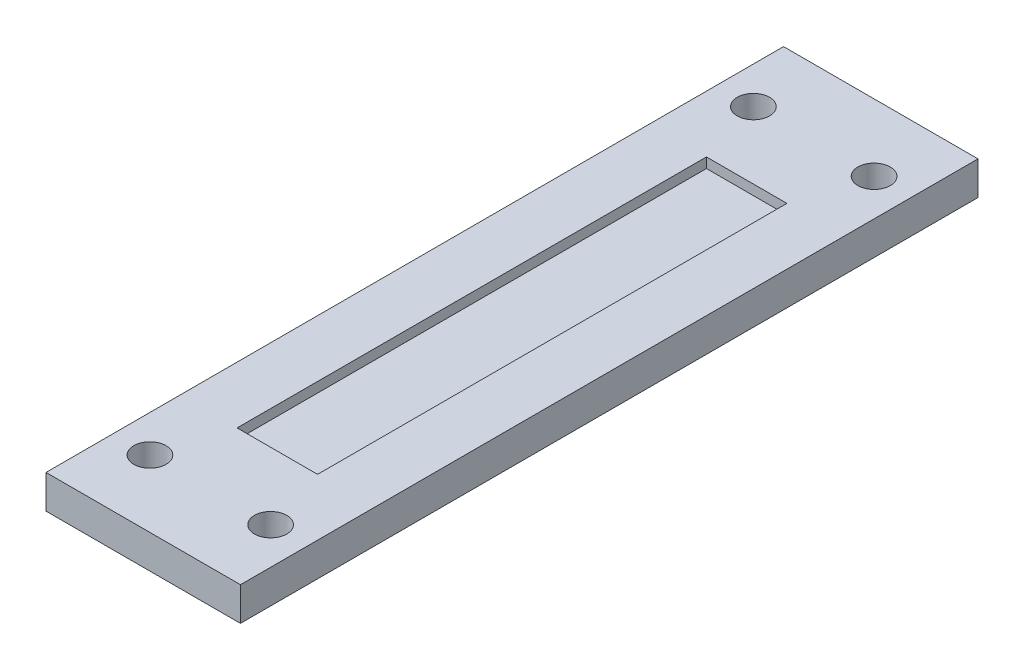
ISO-10303-21;
HEADER;
FILE_DESCRIPTION(('STEP AP214'),'2;1');
FILE_NAME('part.step','',(''),(''),'','','');
FILE_SCHEMA(('AUTOMOTIVE_DESIGN { 1 0 10303 214 1 1 1 1 }'));
ENDSEC;
DATA;
#1=APPLICATION_CONTEXT('core data for automotive mechanical design processes');
#2=APPLICATION_PROTOCOL_DEFINITION('international standard','automotive_design',2000,#1);
#3=PRODUCT_CONTEXT('',#1,'mechanical');
#4=PRODUCT('Part','Part','',(#3));
#5=PRODUCT_RELATED_PRODUCT_CATEGORY('part','',(#4));
#6=PRODUCT_DEFINITION_FORMATION('','',#4);
#7=PRODUCT_DEFINITION_CONTEXT('part definition',#1,'design');
#8=PRODUCT_DEFINITION('design','',#6,#7);
#9=PRODUCT_DEFINITION_SHAPE('','',#8);
#10=(LENGTH_UNIT() NAMED_UNIT(*) SI_UNIT(.MILLI.,.METRE.));
#11=(NAMED_UNIT(*) PLANE_ANGLE_UNIT() SI_UNIT($,.RADIAN.));
#12=(NAMED_UNIT(*) SI_UNIT($,.STERADIAN.) SOLID_ANGLE_UNIT());
#13=UNCERTAINTY_MEASURE_WITH_UNIT(LENGTH_MEASURE(1.E-05),#10,'distance_accuracy_value','');
#14=(GEOMETRIC_REPRESENTATION_CONTEXT(3) GLOBAL_UNCERTAINTY_ASSIGNED_CONTEXT((#13)) GLOBAL_UNIT_ASSIGNED_CONTEXT((#10,
#11,#12)) REPRESENTATION_CONTEXT('',''));
#15=CARTESIAN_POINT('',(0.,0.,0.));
#16=DIRECTION('',(0.,0.,1.));
#17=DIRECTION('',(1.,0.,0.));
#18=AXIS2_PLACEMENT_3D('',#15,#16,#17);
#19=CARTESIAN_POINT('',(-14.5,5.,-55.));
#20=DIRECTION('',(1.,0.,0.));
#21=DIRECTION('',(0.,0.,-1.));
#22=AXIS2_PLACEMENT_3D('',#19,#20,#21);
#23=PLANE('',#22);
#24=DIRECTION('',(0.,0.,1.));
#25=VECTOR('',#24,1.);
#26=CARTESIAN_POINT('',(-14.5,0.,-55.));
#27=LINE('',#26,#25);
#28=CARTESIAN_POINT('',(-14.5,0.,-55.));
#29=VERTEX_POINT('',#28);
#30=CARTESIAN_POINT('',(-14.5,0.,55.));
#31=VERTEX_POINT('',#30);
#32=EDGE_CURVE('E168',#29,#31,#27,.T.);
#33=ORIENTED_EDGE('',*,*,#32,.T.);
#34=DIRECTION('',(0.,-1.,0.));
#35=VECTOR('',#34,1.);
#36=CARTESIAN_POINT('',(-14.5,5.,55.));
#37=LINE('',#36,#35);
#38=CARTESIAN_POINT('',(-14.5,5.,55.));
#39=VERTEX_POINT('',#38);
#40=EDGE_CURVE('E11',#39,#31,#37,.T.);
#41=ORIENTED_EDGE('',*,*,#40,.F.);
#42=DIRECTION('',(0.,0.,1.));
#43=VECTOR('',#42,1.);
#44=CARTESIAN_POINT('',(-14.5,5.,-55.));
#45=LINE('',#44,#43);
#46=CARTESIAN_POINT('',(-14.5,5.,-55.));
#47=VERTEX_POINT('',#46);
#48=EDGE_CURVE('E171',#47,#39,#45,.T.);
#49=ORIENTED_EDGE('',*,*,#48,.F.);
#50=DIRECTION('',(0.,-1.,0.));
#51=VECTOR('',#50,1.);
#52=CARTESIAN_POINT('',(-14.5,5.,-55.));
#53=LINE('',#52,#51);
#54=EDGE_CURVE('E177',#47,#29,#53,.T.);
#55=ORIENTED_EDGE('',*,*,#54,.T.);
#56=EDGE_LOOP('',(#33,#41,#49,#55));
#57=FACE_BOUND('',#56,.T.);
#58=ADVANCED_FACE('F35',(#57),#23,.F.);
#59=CARTESIAN_POINT('',(-14.5,5.,55.));
#60=DIRECTION('',(0.,0.,-1.));
#61=DIRECTION('',(-1.,0.,0.));
#62=AXIS2_PLACEMENT_3D('',#59,#60,#61);
#63=PLANE('',#62);
#64=DIRECTION('',(1.,0.,0.));
#65=VECTOR('',#64,1.);
#66=CARTESIAN_POINT('',(-14.5,0.,55.));
#67=LINE('',#66,#65);
#68=CARTESIAN_POINT('',(14.5,0.,55.));
#69=VERTEX_POINT('',#68);
#70=EDGE_CURVE('E180',#31,#69,#67,.T.);
#71=ORIENTED_EDGE('',*,*,#70,.T.);
#72=DIRECTION('',(0.,-1.,0.));
#73=VECTOR('',#72,1.);
#74=CARTESIAN_POINT('',(14.5,5.,55.));
#75=LINE('',#74,#73);
#76=CARTESIAN_POINT('',(14.5,5.,55.));
#77=VERTEX_POINT('',#76);
#78=EDGE_CURVE('E42',#77,#69,#75,.T.);
#79=ORIENTED_EDGE('',*,*,#78,.F.);
#80=DIRECTION('',(1.,0.,0.));
#81=VECTOR('',#80,1.);
#82=CARTESIAN_POINT('',(-14.5,5.,55.));
#83=LINE('',#82,#81);
#84=EDGE_CURVE('E86',#39,#77,#83,.T.);
#85=ORIENTED_EDGE('',*,*,#84,.F.);
#86=ORIENTED_EDGE('',*,*,#40,.T.);
#87=EDGE_LOOP('',(#71,#79,#85,#86));
#88=FACE_BOUND('',#87,.T.);
#89=ADVANCED_FACE('F209',(#88),#63,.F.);
#90=CARTESIAN_POINT('',(14.5,5.,-55.));
#91=DIRECTION('',(-1.,0.,0.));
#92=DIRECTION('',(0.,0.,1.));
#93=AXIS2_PLACEMENT_3D('',#90,#91,#92);
#94=PLANE('',#93);
#95=DIRECTION('',(0.,0.,-1.));
#96=VECTOR('',#95,1.);
#97=CARTESIAN_POINT('',(14.5,0.,-55.));
#98=LINE('',#97,#96);
#99=CARTESIAN_POINT('',(14.5,0.,-55.));
#100=VERTEX_POINT('',#99);
#101=EDGE_CURVE('E182',#69,#100,#98,.T.);
#102=ORIENTED_EDGE('',*,*,#101,.T.);
#103=DIRECTION('',(0.,-1.,0.));
#104=VECTOR('',#103,1.);
#105=CARTESIAN_POINT('',(14.5,5.,-55.));
#106=LINE('',#105,#104);
#107=CARTESIAN_POINT('',(14.5,5.,-55.));
#108=VERTEX_POINT('',#107);
#109=EDGE_CURVE('E186',#108,#100,#106,.T.);
#110=ORIENTED_EDGE('',*,*,#109,.F.);
#111=DIRECTION('',(0.,0.,-1.));
#112=VECTOR('',#111,1.);
#113=CARTESIAN_POINT('',(14.5,5.,-55.));
#114=LINE('',#113,#112);
#115=EDGE_CURVE('E174',#77,#108,#114,.T.);
#116=ORIENTED_EDGE('',*,*,#115,.F.);
#117=ORIENTED_EDGE('',*,*,#78,.T.);
#118=EDGE_LOOP('',(#102,#110,#116,#117));
#119=FACE_BOUND('',#118,.T.);
#120=ADVANCED_FACE('F191',(#119),#94,.F.);
#121=CARTESIAN_POINT('',(-14.5,5.,-55.));
#122=DIRECTION('',(0.,0.,1.));
#123=DIRECTION('',(1.,0.,0.));
#124=AXIS2_PLACEMENT_3D('',#121,#122,#123);
#125=PLANE('',#124);
#126=DIRECTION('',(-1.,0.,0.));
#127=VECTOR('',#126,1.);
#128=CARTESIAN_POINT('',(-14.5,0.,-55.));
#129=LINE('',#128,#127);
#130=EDGE_CURVE('E79',#100,#29,#129,.T.);
#131=ORIENTED_EDGE('',*,*,#130,.T.);
#132=ORIENTED_EDGE('',*,*,#54,.F.);
#133=DIRECTION('',(-1.,0.,0.));
#134=VECTOR('',#133,1.);
#135=CARTESIAN_POINT('',(-14.5,5.,-55.));
#136=LINE('',#135,#134);
#137=EDGE_CURVE('E58',#108,#47,#136,.T.);
#138=ORIENTED_EDGE('',*,*,#137,.F.);
#139=ORIENTED_EDGE('',*,*,#109,.T.);
#140=EDGE_LOOP('',(#131,#132,#138,#139));
#141=FACE_BOUND('',#140,.T.);
#142=ADVANCED_FACE('F199',(#141),#125,.F.);
#143=CARTESIAN_POINT('',(0.,5.,0.));
#144=DIRECTION('',(0.,1.,0.));
#145=DIRECTION('',(0.,0.,1.));
#146=AXIS2_PLACEMENT_3D('',#143,#144,#145);
#147=PLANE('',#146);
#148=DIRECTION('',(0.,0.,1.));
#149=VECTOR('',#148,1.);
#150=CARTESIAN_POINT('',(-6.,5.,-35.));
#151=LINE('',#150,#149);
#152=CARTESIAN_POINT('',(-6.,5.,-35.));
#153=VERTEX_POINT('',#152);
#154=CARTESIAN_POINT('',(-5.99999999999999,5.,35.));
#155=VERTEX_POINT('',#154);
#156=EDGE_CURVE('E49',#153,#155,#151,.T.);
#157=ORIENTED_EDGE('',*,*,#156,.F.);
#158=DIRECTION('',(-1.,0.,0.));
#159=VECTOR('',#158,1.);
#160=CARTESIAN_POINT('',(-6.,5.,-35.));
#161=LINE('',#160,#159);
#162=CARTESIAN_POINT('',(6.,5.,-35.));
#163=VERTEX_POINT('',#162);
#164=EDGE_CURVE('E128',#163,#153,#161,.T.);
#165=ORIENTED_EDGE('',*,*,#164,.F.);
#166=DIRECTION('',(0.,0.,-1.));
#167=VECTOR('',#166,1.);
#168=CARTESIAN_POINT('',(6.,5.,-35.));
#169=LINE('',#168,#167);
#170=CARTESIAN_POINT('',(6.00000000000001,5.,35.));
#171=VERTEX_POINT('',#170);
#172=EDGE_CURVE('E131',#171,#163,#169,.T.);
#173=ORIENTED_EDGE('',*,*,#172,.F.);
#174=DIRECTION('',(1.,0.,0.));
#175=VECTOR('',#174,1.);
#176=CARTESIAN_POINT('',(-5.99999999999999,5.,35.));
#177=LINE('',#176,#175);
#178=EDGE_CURVE('E137',#155,#171,#177,.T.);
#179=ORIENTED_EDGE('',*,*,#178,.F.);
#180=EDGE_LOOP('',(#157,#165,#173,#179));
#181=FACE_BOUND('',#180,.T.);
#182=CARTESIAN_POINT('',(-9.00000000000001,5.,45.));
#183=DIRECTION('',(0.,1.,0.));
#184=DIRECTION('',(0.,0.,1.));
#185=AXIS2_PLACEMENT_3D('',#182,#183,#184);
#186=CIRCLE('',#185,2.413);
#187=CARTESIAN_POINT('',(-9.00000000000001,5.,47.413));
#188=VERTEX_POINT('',#187);
#189=EDGE_CURVE('E143',#188,#188,#186,.T.);
#190=ORIENTED_EDGE('',*,*,#189,.F.);
#191=EDGE_LOOP('',(#190));
#192=FACE_BOUND('',#191,.T.);
#193=CARTESIAN_POINT('',(9.00000000000001,5.,45.));
#194=DIRECTION('',(0.,1.,0.));
#195=DIRECTION('',(0.,0.,1.));
#196=AXIS2_PLACEMENT_3D('',#193,#194,#195);
#197=CIRCLE('',#196,2.413);
#198=CARTESIAN_POINT('',(9.00000000000001,5.,47.413));
#199=VERTEX_POINT('',#198);
#200=EDGE_CURVE('E150',#199,#199,#197,.T.);
#201=ORIENTED_EDGE('',*,*,#200,.F.);
#202=EDGE_LOOP('',(#201));
#203=FACE_BOUND('',#202,.T.);
#204=CARTESIAN_POINT('',(9.00000000000001,5.,-45.));
#205=DIRECTION('',(0.,1.,0.));
#206=DIRECTION('',(0.,0.,1.));
#207=AXIS2_PLACEMENT_3D('',#204,#205,#206);
#208=CIRCLE('',#207,2.413);
#209=CARTESIAN_POINT('',(9.00000000000001,5.,-42.587));
#210=VERTEX_POINT('',#209);
#211=EDGE_CURVE('E156',#210,#210,#208,.T.);
#212=ORIENTED_EDGE('',*,*,#211,.F.);
#213=EDGE_LOOP('',(#212));
#214=FACE_BOUND('',#213,.T.);
#215=CARTESIAN_POINT('',(-9.00000000000001,5.,-45.));
#216=DIRECTION('',(0.,1.,0.));
#217=DIRECTION('',(0.,0.,1.));
#218=AXIS2_PLACEMENT_3D('',#215,#216,#217);
#219=CIRCLE('',#218,2.413);
#220=CARTESIAN_POINT('',(-9.00000000000001,5.,-42.587));
#221=VERTEX_POINT('',#220);
#222=EDGE_CURVE('E162',#221,#221,#219,.T.);
#223=ORIENTED_EDGE('',*,*,#222,.F.);
#224=EDGE_LOOP('',(#223));
#225=FACE_BOUND('',#224,.T.);
#226=ORIENTED_EDGE('',*,*,#48,.T.);
#227=ORIENTED_EDGE('',*,*,#84,.T.);
#228=ORIENTED_EDGE('',*,*,#115,.T.);
#229=ORIENTED_EDGE('',*,*,#137,.T.);
#230=EDGE_LOOP('',(#226,#227,#228,#229));
#231=FACE_BOUND('',#230,.T.);
#232=ADVANCED_FACE('F201',(#181,#192,#203,#214,#225,#231),#147,.T.);
#233=CARTESIAN_POINT('',(0.,0.,0.));
#234=DIRECTION('',(0.,1.,0.));
#235=DIRECTION('',(0.,0.,1.));
#236=AXIS2_PLACEMENT_3D('',#233,#234,#235);
#237=PLANE('',#236);
#238=CARTESIAN_POINT('',(-9.00000000000001,0.,45.));
#239=DIRECTION('',(0.,1.,0.));
#240=DIRECTION('',(0.,0.,1.));
#241=AXIS2_PLACEMENT_3D('',#238,#239,#240);
#242=CIRCLE('',#241,2.413);
#243=CARTESIAN_POINT('',(-9.00000000000001,0.,47.413));
#244=VERTEX_POINT('',#243);
#245=EDGE_CURVE('E147',#244,#244,#242,.T.);
#246=ORIENTED_EDGE('',*,*,#245,.T.);
#247=EDGE_LOOP('',(#246));
#248=FACE_BOUND('',#247,.T.);
#249=CARTESIAN_POINT('',(9.00000000000001,0.,45.));
#250=DIRECTION('',(0.,1.,0.));
#251=DIRECTION('',(0.,0.,1.));
#252=AXIS2_PLACEMENT_3D('',#249,#250,#251);
#253=CIRCLE('',#252,2.413);
#254=CARTESIAN_POINT('',(9.00000000000001,0.,47.413));
#255=VERTEX_POINT('',#254);
#256=EDGE_CURVE('E153',#255,#255,#253,.T.);
#257=ORIENTED_EDGE('',*,*,#256,.T.);
#258=EDGE_LOOP('',(#257));
#259=FACE_BOUND('',#258,.T.);
#260=CARTESIAN_POINT('',(9.00000000000001,0.,-45.));
#261=DIRECTION('',(0.,1.,0.));
#262=DIRECTION('',(0.,0.,1.));
#263=AXIS2_PLACEMENT_3D('',#260,#261,#262);
#264=CIRCLE('',#263,2.413);
#265=CARTESIAN_POINT('',(9.00000000000001,0.,-42.587));
#266=VERTEX_POINT('',#265);
#267=EDGE_CURVE('E159',#266,#266,#264,.T.);
#268=ORIENTED_EDGE('',*,*,#267,.T.);
#269=EDGE_LOOP('',(#268));
#270=FACE_BOUND('',#269,.T.);
#271=CARTESIAN_POINT('',(-9.00000000000001,0.,-45.));
#272=DIRECTION('',(0.,1.,0.));
#273=DIRECTION('',(0.,0.,1.));
#274=AXIS2_PLACEMENT_3D('',#271,#272,#273);
#275=CIRCLE('',#274,2.413);
#276=CARTESIAN_POINT('',(-9.00000000000001,0.,-42.587));
#277=VERTEX_POINT('',#276);
#278=EDGE_CURVE('E165',#277,#277,#275,.T.);
#279=ORIENTED_EDGE('',*,*,#278,.T.);
#280=EDGE_LOOP('',(#279));
#281=FACE_BOUND('',#280,.T.);
#282=ORIENTED_EDGE('',*,*,#32,.F.);
#283=ORIENTED_EDGE('',*,*,#130,.F.);
#284=ORIENTED_EDGE('',*,*,#101,.F.);
#285=ORIENTED_EDGE('',*,*,#70,.F.);
#286=EDGE_LOOP('',(#282,#283,#284,#285));
#287=FACE_BOUND('',#286,.T.);
#288=ADVANCED_FACE('F195',(#248,#259,#270,#281,#287),#237,.F.);
#289=CARTESIAN_POINT('',(-9.00000000000001,0.,-45.));
#290=DIRECTION('',(0.,1.,0.));
#291=DIRECTION('',(0.,0.,1.));
#292=AXIS2_PLACEMENT_3D('',#289,#290,#291);
#293=CYLINDRICAL_SURFACE('',#292,2.413);
#294=ORIENTED_EDGE('',*,*,#278,.F.);
#295=EDGE_LOOP('',(#294));
#296=FACE_BOUND('',#295,.T.);
#297=ORIENTED_EDGE('',*,*,#222,.T.);
#298=EDGE_LOOP('',(#297));
#299=FACE_BOUND('',#298,.T.);
#300=ADVANCED_FACE('F236',(#296,#299),#293,.F.);
#301=CARTESIAN_POINT('',(9.00000000000001,0.,-45.));
#302=DIRECTION('',(0.,1.,0.));
#303=DIRECTION('',(0.,0.,1.));
#304=AXIS2_PLACEMENT_3D('',#301,#302,#303);
#305=CYLINDRICAL_SURFACE('',#304,2.413);
#306=ORIENTED_EDGE('',*,*,#267,.F.);
#307=EDGE_LOOP('',(#306));
#308=FACE_BOUND('',#307,.T.);
#309=ORIENTED_EDGE('',*,*,#211,.T.);
#310=EDGE_LOOP('',(#309));
#311=FACE_BOUND('',#310,.T.);
#312=ADVANCED_FACE('F245',(#308,#311),#305,.F.);
#313=CARTESIAN_POINT('',(9.00000000000001,0.,45.));
#314=DIRECTION('',(0.,1.,0.));
#315=DIRECTION('',(0.,0.,1.));
#316=AXIS2_PLACEMENT_3D('',#313,#314,#315);
#317=CYLINDRICAL_SURFACE('',#316,2.413);
#318=ORIENTED_EDGE('',*,*,#256,.F.);
#319=EDGE_LOOP('',(#318));
#320=FACE_BOUND('',#319,.T.);
#321=ORIENTED_EDGE('',*,*,#200,.T.);
#322=EDGE_LOOP('',(#321));
#323=FACE_BOUND('',#322,.T.);
#324=ADVANCED_FACE('F255',(#320,#323),#317,.F.);
#325=CARTESIAN_POINT('',(-9.00000000000001,0.,45.));
#326=DIRECTION('',(0.,1.,0.));
#327=DIRECTION('',(0.,0.,1.));
#328=AXIS2_PLACEMENT_3D('',#325,#326,#327);
#329=CYLINDRICAL_SURFACE('',#328,2.413);
#330=ORIENTED_EDGE('',*,*,#245,.F.);
#331=EDGE_LOOP('',(#330));
#332=FACE_BOUND('',#331,.T.);
#333=ORIENTED_EDGE('',*,*,#189,.T.);
#334=EDGE_LOOP('',(#333));
#335=FACE_BOUND('',#334,.T.);
#336=ADVANCED_FACE('F265',(#332,#335),#329,.F.);
#337=CARTESIAN_POINT('',(-6.,3.5,-35.));
#338=DIRECTION('',(-1.,0.,0.));
#339=DIRECTION('',(0.,0.,1.));
#340=AXIS2_PLACEMENT_3D('',#337,#338,#339);
#341=PLANE('',#340);
#342=ORIENTED_EDGE('',*,*,#156,.T.);
#343=DIRECTION('',(0.,1.,0.));
#344=VECTOR('',#343,1.);
#345=CARTESIAN_POINT('',(-5.99999999999999,3.5,35.));
#346=LINE('',#345,#344);
#347=CARTESIAN_POINT('',(-5.99999999999999,3.5,35.));
#348=VERTEX_POINT('',#347);
#349=EDGE_CURVE('E106',#348,#155,#346,.T.);
#350=ORIENTED_EDGE('',*,*,#349,.F.);
#351=DIRECTION('',(0.,0.,1.));
#352=VECTOR('',#351,1.);
#353=CARTESIAN_POINT('',(-6.,3.5,-35.));
#354=LINE('',#353,#352);
#355=CARTESIAN_POINT('',(-6.,3.5,-35.));
#356=VERTEX_POINT('',#355);
#357=EDGE_CURVE('E110',#356,#348,#354,.T.);
#358=ORIENTED_EDGE('',*,*,#357,.F.);
#359=DIRECTION('',(0.,1.,0.));
#360=VECTOR('',#359,1.);
#361=CARTESIAN_POINT('',(-6.,3.5,-35.));
#362=LINE('',#361,#360);
#363=EDGE_CURVE('E141',#356,#153,#362,.T.);
#364=ORIENTED_EDGE('',*,*,#363,.T.);
#365=EDGE_LOOP('',(#342,#350,#358,#364));
#366=FACE_BOUND('',#365,.T.);
#367=ADVANCED_FACE('F108',(#366),#341,.F.);
#368=CARTESIAN_POINT('',(-6.,3.5,-35.));
#369=DIRECTION('',(0.,0.,-1.));
#370=DIRECTION('',(-1.,0.,0.));
#371=AXIS2_PLACEMENT_3D('',#368,#369,#370);
#372=PLANE('',#371);
#373=ORIENTED_EDGE('',*,*,#164,.T.);
#374=ORIENTED_EDGE('',*,*,#363,.F.);
#375=DIRECTION('',(-1.,0.,0.));
#376=VECTOR('',#375,1.);
#377=CARTESIAN_POINT('',(-6.,3.5,-35.));
#378=LINE('',#377,#376);
#379=CARTESIAN_POINT('',(6.,3.5,-35.));
#380=VERTEX_POINT('',#379);
#381=EDGE_CURVE('E116',#380,#356,#378,.T.);
#382=ORIENTED_EDGE('',*,*,#381,.F.);
#383=DIRECTION('',(0.,1.,0.));
#384=VECTOR('',#383,1.);
#385=CARTESIAN_POINT('',(6.,3.5,-35.));
#386=LINE('',#385,#384);
#387=EDGE_CURVE('E144',#380,#163,#386,.T.);
#388=ORIENTED_EDGE('',*,*,#387,.T.);
#389=EDGE_LOOP('',(#373,#374,#382,#388));
#390=FACE_BOUND('',#389,.T.);
#391=ADVANCED_FACE('F289',(#390),#372,.F.);
#392=CARTESIAN_POINT('',(6.,3.5,-35.));
#393=DIRECTION('',(1.,0.,0.));
#394=DIRECTION('',(0.,0.,-1.));
#395=AXIS2_PLACEMENT_3D('',#392,#393,#394);
#396=PLANE('',#395);
#397=ORIENTED_EDGE('',*,*,#172,.T.);
#398=ORIENTED_EDGE('',*,*,#387,.F.);
#399=DIRECTION('',(0.,0.,-1.));
#400=VECTOR('',#399,1.);
#401=CARTESIAN_POINT('',(6.,3.5,-35.));
#402=LINE('',#401,#400);
#403=CARTESIAN_POINT('',(6.00000000000001,3.5,35.));
#404=VERTEX_POINT('',#403);
#405=EDGE_CURVE('E124',#404,#380,#402,.T.);
#406=ORIENTED_EDGE('',*,*,#405,.F.);
#407=DIRECTION('',(0.,1.,0.));
#408=VECTOR('',#407,1.);
#409=CARTESIAN_POINT('',(6.00000000000001,3.5,35.));
#410=LINE('',#409,#408);
#411=EDGE_CURVE('E115',#404,#171,#410,.T.);
#412=ORIENTED_EDGE('',*,*,#411,.T.);
#413=EDGE_LOOP('',(#397,#398,#406,#412));
#414=FACE_BOUND('',#413,.T.);
#415=ADVANCED_FACE('F298',(#414),#396,.F.);
#416=CARTESIAN_POINT('',(-5.99999999999999,3.5,35.));
#417=DIRECTION('',(0.,0.,1.));
#418=DIRECTION('',(1.,0.,0.));
#419=AXIS2_PLACEMENT_3D('',#416,#417,#418);
#420=PLANE('',#419);
#421=ORIENTED_EDGE('',*,*,#178,.T.);
#422=ORIENTED_EDGE('',*,*,#411,.F.);
#423=DIRECTION('',(1.,0.,0.));
#424=VECTOR('',#423,1.);
#425=CARTESIAN_POINT('',(-5.99999999999999,3.5,35.));
#426=LINE('',#425,#424);
#427=EDGE_CURVE('E119',#348,#404,#426,.T.);
#428=ORIENTED_EDGE('',*,*,#427,.F.);
#429=ORIENTED_EDGE('',*,*,#349,.T.);
#430=EDGE_LOOP('',(#421,#422,#428,#429));
#431=FACE_BOUND('',#430,.T.);
#432=ADVANCED_FACE('F120',(#431),#420,.F.);
#433=CARTESIAN_POINT('',(0.,3.5,0.));
#434=DIRECTION('',(0.,1.,0.));
#435=DIRECTION('',(0.,0.,1.));
#436=AXIS2_PLACEMENT_3D('',#433,#434,#435);
#437=PLANE('',#436);
#438=ORIENTED_EDGE('',*,*,#357,.T.);
#439=ORIENTED_EDGE('',*,*,#427,.T.);
#440=ORIENTED_EDGE('',*,*,#405,.T.);
#441=ORIENTED_EDGE('',*,*,#381,.T.);
#442=EDGE_LOOP('',(#438,#439,#440,#441));
#443=FACE_BOUND('',#442,.T.);
#444=ADVANCED_FACE('F126',(#443),#437,.T.);
#445=CLOSED_SHELL('',(#58,#89,#120,#142,#232,#288,#300,#312,#324,#336,#367,#391,#415,#432,#444));
#446=MANIFOLD_SOLID_BREP('B2',#445);
#447=ADVANCED_BREP_SHAPE_REPRESENTATION('',(#18,#446),#14);
#448=SHAPE_DEFINITION_REPRESENTATION(#9,#447);
ENDSEC;
END-ISO-10303-21;
